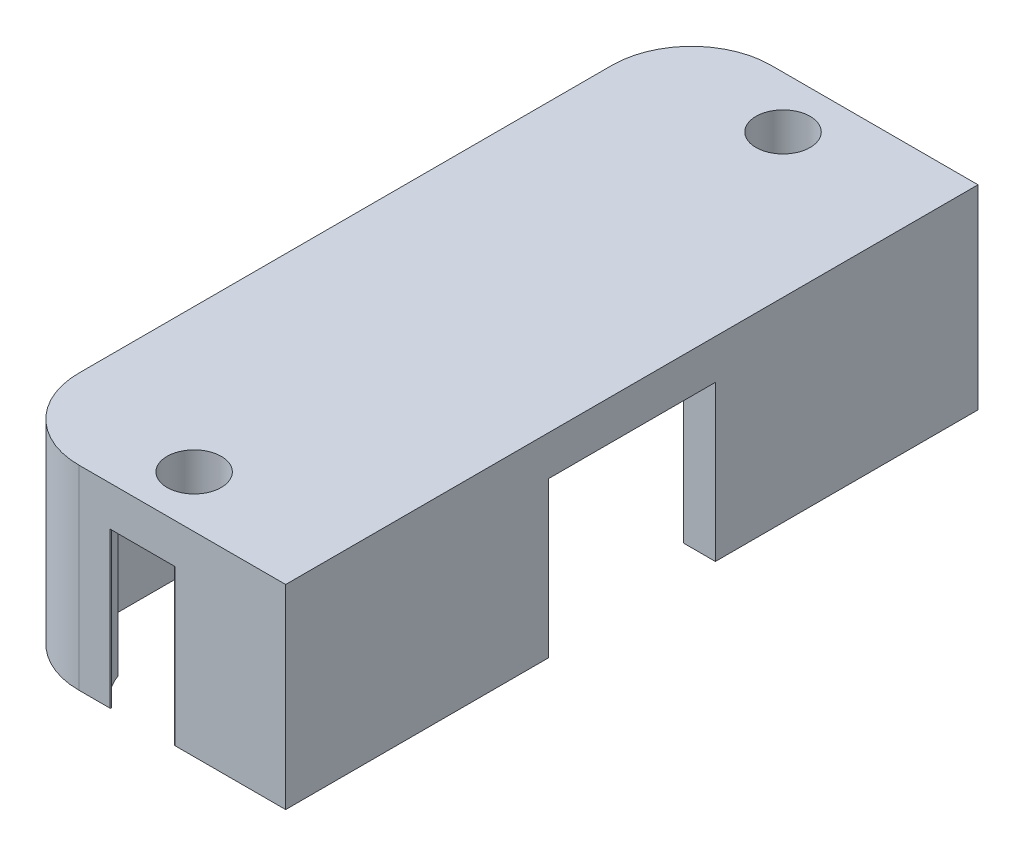
ISO-10303-21;
HEADER;
FILE_DESCRIPTION(('STEP AP214'),'2;1');
FILE_NAME('part.step','',(''),(''),'','','');
FILE_SCHEMA(('AUTOMOTIVE_DESIGN { 1 0 10303 214 1 1 1 1 }'));
ENDSEC;
DATA;
#1=APPLICATION_CONTEXT('core data for automotive mechanical design processes');
#2=APPLICATION_PROTOCOL_DEFINITION('international standard','automotive_design',2000,#1);
#3=PRODUCT_CONTEXT('',#1,'mechanical');
#4=PRODUCT('Part','Part','',(#3));
#5=PRODUCT_RELATED_PRODUCT_CATEGORY('part','',(#4));
#6=PRODUCT_DEFINITION_FORMATION('','',#4);
#7=PRODUCT_DEFINITION_CONTEXT('part definition',#1,'design');
#8=PRODUCT_DEFINITION('design','',#6,#7);
#9=PRODUCT_DEFINITION_SHAPE('','',#8);
#10=(LENGTH_UNIT() NAMED_UNIT(*) SI_UNIT(.MILLI.,.METRE.));
#11=(NAMED_UNIT(*) PLANE_ANGLE_UNIT() SI_UNIT($,.RADIAN.));
#12=(NAMED_UNIT(*) SI_UNIT($,.STERADIAN.) SOLID_ANGLE_UNIT());
#13=UNCERTAINTY_MEASURE_WITH_UNIT(LENGTH_MEASURE(1.E-05),#10,'distance_accuracy_value','');
#14=(GEOMETRIC_REPRESENTATION_CONTEXT(3) GLOBAL_UNCERTAINTY_ASSIGNED_CONTEXT((#13)) GLOBAL_UNIT_ASSIGNED_CONTEXT((#10,
#11,#12)) REPRESENTATION_CONTEXT('',''));
#15=CARTESIAN_POINT('',(0.,0.,0.));
#16=DIRECTION('',(0.,0.,1.));
#17=DIRECTION('',(1.,0.,0.));
#18=AXIS2_PLACEMENT_3D('',#15,#16,#17);
#19=CARTESIAN_POINT('',(-4.,-9.75,19.75));
#20=DIRECTION('',(0.,0.,1.));
#21=DIRECTION('',(1.,0.,0.));
#22=AXIS2_PLACEMENT_3D('',#19,#20,#21);
#23=PLANE('',#22);
#24=DIRECTION('',(0.,1.,0.));
#25=VECTOR('',#24,1.);
#26=CARTESIAN_POINT('',(3.53553390593274,-9.75,19.75));
#27=LINE('',#26,#25);
#28=CARTESIAN_POINT('',(3.53553390593274,0.,19.75));
#29=VERTEX_POINT('',#28);
#30=CARTESIAN_POINT('',(3.53553390593274,-9.75,19.75));
#31=VERTEX_POINT('',#30);
#32=EDGE_CURVE('E223',#29,#31,#27,.F.);
#33=ORIENTED_EDGE('',*,*,#32,.F.);
#34=DIRECTION('',(1.,0.,0.));
#35=VECTOR('',#34,1.);
#36=CARTESIAN_POINT('',(-4.,0.,19.75));
#37=LINE('',#36,#35);
#38=CARTESIAN_POINT('',(7.,0.,19.75));
#39=VERTEX_POINT('',#38);
#40=EDGE_CURVE('E235',#29,#39,#37,.T.);
#41=ORIENTED_EDGE('',*,*,#40,.T.);
#42=DIRECTION('',(0.,1.,0.));
#43=VECTOR('',#42,1.);
#44=CARTESIAN_POINT('',(7.,-24.3872811683044,19.75));
#45=LINE('',#44,#43);
#46=CARTESIAN_POINT('',(7.,-9.75,19.75));
#47=VERTEX_POINT('',#46);
#48=EDGE_CURVE('E409',#47,#39,#45,.T.);
#49=ORIENTED_EDGE('',*,*,#48,.F.);
#50=DIRECTION('',(1.,0.,0.));
#51=VECTOR('',#50,1.);
#52=CARTESIAN_POINT('',(-4.,-9.75,19.75));
#53=LINE('',#52,#51);
#54=EDGE_CURVE('E237',#31,#47,#53,.T.);
#55=ORIENTED_EDGE('',*,*,#54,.F.);
#56=EDGE_LOOP('',(#33,#41,#49,#55));
#57=FACE_BOUND('',#56,.T.);
#58=ADVANCED_FACE('F35',(#57),#23,.F.);
#59=CARTESIAN_POINT('',(9.,-9.75,-19.75));
#60=DIRECTION('',(0.,0.,-1.));
#61=DIRECTION('',(-1.,0.,0.));
#62=AXIS2_PLACEMENT_3D('',#59,#60,#61);
#63=PLANE('',#62);
#64=DIRECTION('',(0.,1.,0.));
#65=VECTOR('',#64,1.);
#66=CARTESIAN_POINT('',(-3.53553390593274,-9.75,-19.75));
#67=LINE('',#66,#65);
#68=CARTESIAN_POINT('',(-3.53553390593274,0.,-19.75));
#69=VERTEX_POINT('',#68);
#70=CARTESIAN_POINT('',(-3.53553390593274,-9.75,-19.75));
#71=VERTEX_POINT('',#70);
#72=EDGE_CURVE('E448',#69,#71,#67,.F.);
#73=ORIENTED_EDGE('',*,*,#72,.F.);
#74=DIRECTION('',(-1.,0.,0.));
#75=VECTOR('',#74,1.);
#76=CARTESIAN_POINT('',(9.,0.,-19.75));
#77=LINE('',#76,#75);
#78=CARTESIAN_POINT('',(-4.,0.,-19.75));
#79=VERTEX_POINT('',#78);
#80=EDGE_CURVE('E253',#69,#79,#77,.T.);
#81=ORIENTED_EDGE('',*,*,#80,.T.);
#82=DIRECTION('',(0.,1.,0.));
#83=VECTOR('',#82,1.);
#84=CARTESIAN_POINT('',(-4.,-9.75,-19.75));
#85=LINE('',#84,#83);
#86=CARTESIAN_POINT('',(-4.,-9.75,-19.75));
#87=VERTEX_POINT('',#86);
#88=EDGE_CURVE('E272',#87,#79,#85,.T.);
#89=ORIENTED_EDGE('',*,*,#88,.F.);
#90=DIRECTION('',(-1.,0.,0.));
#91=VECTOR('',#90,1.);
#92=CARTESIAN_POINT('',(9.,-9.75,-19.75));
#93=LINE('',#92,#91);
#94=EDGE_CURVE('E417',#71,#87,#93,.T.);
#95=ORIENTED_EDGE('',*,*,#94,.F.);
#96=EDGE_LOOP('',(#73,#81,#89,#95));
#97=FACE_BOUND('',#96,.T.);
#98=ADVANCED_FACE('F430',(#97),#63,.F.);
#99=CARTESIAN_POINT('',(-4.,-9.75,-16.75));
#100=DIRECTION('',(0.,-1.,0.));
#101=DIRECTION('',(0.,0.,-1.));
#102=AXIS2_PLACEMENT_3D('',#99,#100,#101);
#103=PLANE('',#102);
#104=CARTESIAN_POINT('',(0.,-9.75,18.5));
#105=DIRECTION('',(0.,-1.,0.));
#106=DIRECTION('',(0.,0.,-1.));
#107=AXIS2_PLACEMENT_3D('',#104,#105,#106);
#108=CIRCLE('',#107,3.75);
#109=CARTESIAN_POINT('',(-2.02242449328149,-9.75,21.6578947368421));
#110=VERTEX_POINT('',#109);
#111=CARTESIAN_POINT('',(-3.53553390593274,-9.75,19.75));
#112=VERTEX_POINT('',#111);
#113=EDGE_CURVE('E229',#110,#112,#108,.T.);
#114=ORIENTED_EDGE('',*,*,#113,.F.);
#115=CARTESIAN_POINT('',(-2.04939015319191,-9.75,21.7));
#116=DIRECTION('',(0.,-1.,0.));
#117=DIRECTION('',(0.,0.,-1.));
#118=AXIS2_PLACEMENT_3D('',#115,#116,#117);
#119=CIRCLE('',#118,0.05);
#120=CARTESIAN_POINT('',(-2.04939015319191,-9.75,21.75));
#121=VERTEX_POINT('',#120);
#122=EDGE_CURVE('E321',#110,#121,#119,.T.);
#123=ORIENTED_EDGE('',*,*,#122,.T.);
#124=DIRECTION('',(1.,0.,0.));
#125=VECTOR('',#124,1.);
#126=CARTESIAN_POINT('',(-4.,-9.75,21.75));
#127=LINE('',#126,#125);
#128=CARTESIAN_POINT('',(-4.,-9.75,21.75));
#129=VERTEX_POINT('',#128);
#130=EDGE_CURVE('E382',#129,#121,#127,.T.);
#131=ORIENTED_EDGE('',*,*,#130,.F.);
#132=CARTESIAN_POINT('',(-4.,-9.75,16.75));
#133=DIRECTION('',(0.,-1.,0.));
#134=DIRECTION('',(0.,0.,-1.));
#135=AXIS2_PLACEMENT_3D('',#132,#133,#134);
#136=CIRCLE('',#135,5.);
#137=CARTESIAN_POINT('',(-9.,-9.75,16.75));
#138=VERTEX_POINT('',#137);
#139=EDGE_CURVE('E378',#129,#138,#136,.T.);
#140=ORIENTED_EDGE('',*,*,#139,.T.);
#141=DIRECTION('',(0.,0.,1.));
#142=VECTOR('',#141,1.);
#143=CARTESIAN_POINT('',(-9.,-9.75,-16.75));
#144=LINE('',#143,#142);
#145=CARTESIAN_POINT('',(-9.,-9.75,-16.75));
#146=VERTEX_POINT('',#145);
#147=EDGE_CURVE('E370',#146,#138,#144,.T.);
#148=ORIENTED_EDGE('',*,*,#147,.F.);
#149=CARTESIAN_POINT('',(-4.,-9.75,-16.75));
#150=DIRECTION('',(0.,-1.,0.));
#151=DIRECTION('',(0.,0.,-1.));
#152=AXIS2_PLACEMENT_3D('',#149,#150,#151);
#153=CIRCLE('',#152,5.);
#154=CARTESIAN_POINT('',(-4.,-9.75,-21.75));
#155=VERTEX_POINT('',#154);
#156=EDGE_CURVE('E366',#146,#155,#153,.T.);
#157=ORIENTED_EDGE('',*,*,#156,.T.);
#158=DIRECTION('',(-1.,0.,0.));
#159=VECTOR('',#158,1.);
#160=CARTESIAN_POINT('',(9.,-9.75,-21.75));
#161=LINE('',#160,#159);
#162=CARTESIAN_POINT('',(-2.04939015319193,-9.75,-21.75));
#163=VERTEX_POINT('',#162);
#164=EDGE_CURVE('E367',#163,#155,#161,.T.);
#165=ORIENTED_EDGE('',*,*,#164,.F.);
#166=CARTESIAN_POINT('',(-2.04939015319193,-9.75,-21.7));
#167=DIRECTION('',(0.,-1.,0.));
#168=DIRECTION('',(0.,0.,-1.));
#169=AXIS2_PLACEMENT_3D('',#166,#167,#168);
#170=CIRCLE('',#169,0.05);
#171=CARTESIAN_POINT('',(-2.02242449328151,-9.75,-21.6578947368421));
#172=VERTEX_POINT('',#171);
#173=EDGE_CURVE('E319',#163,#172,#170,.T.);
#174=ORIENTED_EDGE('',*,*,#173,.T.);
#175=CARTESIAN_POINT('',(0.,-9.75,-18.5));
#176=DIRECTION('',(0.,-1.,0.));
#177=DIRECTION('',(0.,0.,-1.));
#178=AXIS2_PLACEMENT_3D('',#175,#176,#177);
#179=CIRCLE('',#178,3.75);
#180=EDGE_CURVE('E350',#71,#172,#179,.T.);
#181=ORIENTED_EDGE('',*,*,#180,.F.);
#182=ORIENTED_EDGE('',*,*,#94,.T.);
#183=CARTESIAN_POINT('',(-4.,-9.75,-16.75));
#184=DIRECTION('',(0.,-1.,0.));
#185=DIRECTION('',(0.,0.,-1.));
#186=AXIS2_PLACEMENT_3D('',#183,#184,#185);
#187=CIRCLE('',#186,3.00000000000001);
#188=CARTESIAN_POINT('',(-7.,-9.75,-16.75));
#189=VERTEX_POINT('',#188);
#190=EDGE_CURVE('E261',#189,#87,#187,.T.);
#191=ORIENTED_EDGE('',*,*,#190,.F.);
#192=DIRECTION('',(0.,0.,1.));
#193=VECTOR('',#192,1.);
#194=CARTESIAN_POINT('',(-7.,-9.75,-16.75));
#195=LINE('',#194,#193);
#196=CARTESIAN_POINT('',(-7.,-9.75,16.75));
#197=VERTEX_POINT('',#196);
#198=EDGE_CURVE('E275',#189,#197,#195,.T.);
#199=ORIENTED_EDGE('',*,*,#198,.T.);
#200=CARTESIAN_POINT('',(-4.,-9.75,16.75));
#201=DIRECTION('',(0.,-1.,0.));
#202=DIRECTION('',(0.,0.,-1.));
#203=AXIS2_PLACEMENT_3D('',#200,#201,#202);
#204=CIRCLE('',#203,3.);
#205=CARTESIAN_POINT('',(-4.,-9.75,19.75));
#206=VERTEX_POINT('',#205);
#207=EDGE_CURVE('E390',#206,#197,#204,.T.);
#208=ORIENTED_EDGE('',*,*,#207,.F.);
#209=EDGE_CURVE('E387',#206,#112,#53,.T.);
#210=ORIENTED_EDGE('',*,*,#209,.T.);
#211=EDGE_LOOP('',(#114,#123,#131,#140,#148,#157,#165,#174,#181,#182,#191,#199,#208,#210));
#212=FACE_BOUND('',#211,.T.);
#213=ADVANCED_FACE('F426',(#212),#103,.T.);
#214=CARTESIAN_POINT('',(2.04939015319191,-9.75,21.75));
#215=VERTEX_POINT('',#214);
#216=CARTESIAN_POINT('',(9.,-9.75,21.75));
#217=VERTEX_POINT('',#216);
#218=EDGE_CURVE('E381',#215,#217,#127,.T.);
#219=ORIENTED_EDGE('',*,*,#218,.F.);
#220=CARTESIAN_POINT('',(2.04939015319191,-9.75,21.7));
#221=DIRECTION('',(0.,-1.,0.));
#222=DIRECTION('',(0.,0.,-1.));
#223=AXIS2_PLACEMENT_3D('',#220,#221,#222);
#224=CIRCLE('',#223,0.05);
#225=CARTESIAN_POINT('',(2.02242449328149,-9.75,21.6578947368421));
#226=VERTEX_POINT('',#225);
#227=EDGE_CURVE('E314',#215,#226,#224,.T.);
#228=ORIENTED_EDGE('',*,*,#227,.T.);
#229=EDGE_CURVE('E499',#31,#226,#108,.T.);
#230=ORIENTED_EDGE('',*,*,#229,.F.);
#231=ORIENTED_EDGE('',*,*,#54,.T.);
#232=DIRECTION('',(0.,0.,-1.));
#233=VECTOR('',#232,1.);
#234=CARTESIAN_POINT('',(7.,-9.75,19.75));
#235=LINE('',#234,#233);
#236=CARTESIAN_POINT('',(7.,-9.75,5.25));
#237=VERTEX_POINT('',#236);
#238=EDGE_CURVE('E395',#47,#237,#235,.T.);
#239=ORIENTED_EDGE('',*,*,#238,.T.);
#240=DIRECTION('',(1.,0.,0.));
#241=VECTOR('',#240,1.);
#242=CARTESIAN_POINT('',(9.,-9.75,5.25));
#243=LINE('',#242,#241);
#244=CARTESIAN_POINT('',(9.,-9.75,5.25));
#245=VERTEX_POINT('',#244);
#246=EDGE_CURVE('E399',#237,#245,#243,.T.);
#247=ORIENTED_EDGE('',*,*,#246,.T.);
#248=DIRECTION('',(0.,0.,-1.));
#249=VECTOR('',#248,1.);
#250=CARTESIAN_POINT('',(9.,-9.75,21.75));
#251=LINE('',#250,#249);
#252=EDGE_CURVE('E385',#217,#245,#251,.T.);
#253=ORIENTED_EDGE('',*,*,#252,.F.);
#254=EDGE_LOOP('',(#219,#228,#230,#231,#239,#247,#253));
#255=FACE_BOUND('',#254,.T.);
#256=ADVANCED_FACE('F491',(#255),#103,.T.);
#257=DIRECTION('',(0.,1.,0.));
#258=VECTOR('',#257,1.);
#259=CARTESIAN_POINT('',(3.53553390593274,-9.75,-19.75));
#260=LINE('',#259,#258);
#261=CARTESIAN_POINT('',(3.53553390593274,-9.75,-19.75));
#262=VERTEX_POINT('',#261);
#263=CARTESIAN_POINT('',(3.53553390593274,0.,-19.75));
#264=VERTEX_POINT('',#263);
#265=EDGE_CURVE('E349',#262,#264,#260,.T.);
#266=ORIENTED_EDGE('',*,*,#265,.F.);
#267=CARTESIAN_POINT('',(7.00000000000001,-9.75,-19.75));
#268=VERTEX_POINT('',#267);
#269=EDGE_CURVE('E418',#268,#262,#93,.T.);
#270=ORIENTED_EDGE('',*,*,#269,.F.);
#271=DIRECTION('',(0.,1.,0.));
#272=VECTOR('',#271,1.);
#273=CARTESIAN_POINT('',(7.,-24.3872811683044,-19.75));
#274=LINE('',#273,#272);
#275=CARTESIAN_POINT('',(7.,0.,-19.75));
#276=VERTEX_POINT('',#275);
#277=EDGE_CURVE('E464',#268,#276,#274,.T.);
#278=ORIENTED_EDGE('',*,*,#277,.T.);
#279=EDGE_CURVE('E248',#276,#264,#77,.T.);
#280=ORIENTED_EDGE('',*,*,#279,.T.);
#281=EDGE_LOOP('',(#266,#270,#278,#280));
#282=FACE_BOUND('',#281,.T.);
#283=ADVANCED_FACE('F542',(#282),#63,.F.);
#284=DIRECTION('',(0.,1.,0.));
#285=VECTOR('',#284,1.);
#286=CARTESIAN_POINT('',(-3.53553390593274,-9.75,19.75));
#287=LINE('',#286,#285);
#288=CARTESIAN_POINT('',(-3.53553390593274,0.,19.75));
#289=VERTEX_POINT('',#288);
#290=EDGE_CURVE('E239',#112,#289,#287,.T.);
#291=ORIENTED_EDGE('',*,*,#290,.F.);
#292=ORIENTED_EDGE('',*,*,#209,.F.);
#293=DIRECTION('',(0.,1.,0.));
#294=VECTOR('',#293,1.);
#295=CARTESIAN_POINT('',(-4.,-9.75,19.75));
#296=LINE('',#295,#294);
#297=CARTESIAN_POINT('',(-4.,0.,19.75));
#298=VERTEX_POINT('',#297);
#299=EDGE_CURVE('E269',#206,#298,#296,.T.);
#300=ORIENTED_EDGE('',*,*,#299,.T.);
#301=EDGE_CURVE('E247',#298,#289,#37,.T.);
#302=ORIENTED_EDGE('',*,*,#301,.T.);
#303=EDGE_LOOP('',(#291,#292,#300,#302));
#304=FACE_BOUND('',#303,.T.);
#305=ADVANCED_FACE('F444',(#304),#23,.F.);
#306=CARTESIAN_POINT('',(9.,2.5,21.75));
#307=DIRECTION('',(0.,0.,-1.));
#308=DIRECTION('',(-1.,0.,0.));
#309=AXIS2_PLACEMENT_3D('',#306,#307,#308);
#310=PLANE('',#309);
#311=DIRECTION('',(-1.,0.,0.));
#312=VECTOR('',#311,1.);
#313=CARTESIAN_POINT('',(9.,0.,21.75));
#314=LINE('',#313,#312);
#315=CARTESIAN_POINT('',(2.04939015319191,0.,21.75));
#316=VERTEX_POINT('',#315);
#317=CARTESIAN_POINT('',(-2.04939015319191,0.,21.75));
#318=VERTEX_POINT('',#317);
#319=EDGE_CURVE('E497',#316,#318,#314,.T.);
#320=ORIENTED_EDGE('',*,*,#319,.F.);
#321=DIRECTION('',(0.,-1.,0.));
#322=VECTOR('',#321,1.);
#323=CARTESIAN_POINT('',(2.04939015319191,-9.75,21.75));
#324=LINE('',#323,#322);
#325=EDGE_CURVE('E312',#316,#215,#324,.T.);
#326=ORIENTED_EDGE('',*,*,#325,.T.);
#327=ORIENTED_EDGE('',*,*,#218,.T.);
#328=DIRECTION('',(0.,-1.,0.));
#329=VECTOR('',#328,1.);
#330=CARTESIAN_POINT('',(9.,2.5,21.75));
#331=LINE('',#330,#329);
#332=CARTESIAN_POINT('',(9.,2.5,21.75));
#333=VERTEX_POINT('',#332);
#334=EDGE_CURVE('E290',#333,#217,#331,.T.);
#335=ORIENTED_EDGE('',*,*,#334,.F.);
#336=DIRECTION('',(1.,0.,0.));
#337=VECTOR('',#336,1.);
#338=CARTESIAN_POINT('',(9.,2.5,21.75));
#339=LINE('',#338,#337);
#340=CARTESIAN_POINT('',(-4.,2.5,21.75));
#341=VERTEX_POINT('',#340);
#342=EDGE_CURVE('E279',#341,#333,#339,.T.);
#343=ORIENTED_EDGE('',*,*,#342,.F.);
#344=DIRECTION('',(0.,-1.,0.));
#345=VECTOR('',#344,1.);
#346=CARTESIAN_POINT('',(-4.,2.5,21.75));
#347=LINE('',#346,#345);
#348=EDGE_CURVE('E303',#341,#129,#347,.T.);
#349=ORIENTED_EDGE('',*,*,#348,.T.);
#350=ORIENTED_EDGE('',*,*,#130,.T.);
#351=DIRECTION('',(0.,-1.,0.));
#352=VECTOR('',#351,1.);
#353=CARTESIAN_POINT('',(-2.04939015319191,0.,21.75));
#354=LINE('',#353,#352);
#355=EDGE_CURVE('E309',#121,#318,#354,.F.);
#356=ORIENTED_EDGE('',*,*,#355,.T.);
#357=EDGE_LOOP('',(#320,#326,#327,#335,#343,#349,#350,#356));
#358=FACE_BOUND('',#357,.T.);
#359=ADVANCED_FACE('F502',(#358),#310,.F.);
#360=CARTESIAN_POINT('',(9.,2.5,-21.75));
#361=DIRECTION('',(0.,0.,1.));
#362=DIRECTION('',(1.,0.,0.));
#363=AXIS2_PLACEMENT_3D('',#360,#361,#362);
#364=PLANE('',#363);
#365=CARTESIAN_POINT('',(9.,-9.75,-21.75));
#366=VERTEX_POINT('',#365);
#367=CARTESIAN_POINT('',(2.04939015319193,-9.75,-21.75));
#368=VERTEX_POINT('',#367);
#369=EDGE_CURVE('E358',#366,#368,#161,.T.);
#370=ORIENTED_EDGE('',*,*,#369,.T.);
#371=DIRECTION('',(0.,-1.,0.));
#372=VECTOR('',#371,1.);
#373=CARTESIAN_POINT('',(2.04939015319193,0.,-21.75));
#374=LINE('',#373,#372);
#375=CARTESIAN_POINT('',(2.04939015319193,0.,-21.75));
#376=VERTEX_POINT('',#375);
#377=EDGE_CURVE('E330',#368,#376,#374,.F.);
#378=ORIENTED_EDGE('',*,*,#377,.T.);
#379=DIRECTION('',(1.,0.,0.));
#380=VECTOR('',#379,1.);
#381=CARTESIAN_POINT('',(9.,0.,-21.75));
#382=LINE('',#381,#380);
#383=CARTESIAN_POINT('',(-2.04939015319193,0.,-21.75));
#384=VERTEX_POINT('',#383);
#385=EDGE_CURVE('E55',#384,#376,#382,.T.);
#386=ORIENTED_EDGE('',*,*,#385,.F.);
#387=DIRECTION('',(0.,-1.,0.));
#388=VECTOR('',#387,1.);
#389=CARTESIAN_POINT('',(-2.04939015319193,-9.75,-21.75));
#390=LINE('',#389,#388);
#391=EDGE_CURVE('E328',#384,#163,#390,.T.);
#392=ORIENTED_EDGE('',*,*,#391,.T.);
#393=ORIENTED_EDGE('',*,*,#164,.T.);
#394=DIRECTION('',(0.,-1.,0.));
#395=VECTOR('',#394,1.);
#396=CARTESIAN_POINT('',(-4.,2.5,-21.75));
#397=LINE('',#396,#395);
#398=CARTESIAN_POINT('',(-4.,2.5,-21.75));
#399=VERTEX_POINT('',#398);
#400=EDGE_CURVE('E297',#155,#399,#397,.F.);
#401=ORIENTED_EDGE('',*,*,#400,.T.);
#402=DIRECTION('',(-1.,0.,0.));
#403=VECTOR('',#402,1.);
#404=CARTESIAN_POINT('',(9.,2.5,-21.75));
#405=LINE('',#404,#403);
#406=CARTESIAN_POINT('',(9.,2.5,-21.75));
#407=VERTEX_POINT('',#406);
#408=EDGE_CURVE('E283',#407,#399,#405,.T.);
#409=ORIENTED_EDGE('',*,*,#408,.F.);
#410=DIRECTION('',(0.,-1.,0.));
#411=VECTOR('',#410,1.);
#412=CARTESIAN_POINT('',(9.,2.5,-21.75));
#413=LINE('',#412,#411);
#414=EDGE_CURVE('E286',#407,#366,#413,.T.);
#415=ORIENTED_EDGE('',*,*,#414,.T.);
#416=EDGE_LOOP('',(#370,#378,#386,#392,#393,#401,#409,#415));
#417=FACE_BOUND('',#416,.T.);
#418=ADVANCED_FACE('F363',(#417),#364,.F.);
#419=CARTESIAN_POINT('',(0.,2.5,-18.5));
#420=DIRECTION('',(0.,1.,0.));
#421=DIRECTION('',(0.,0.,1.));
#422=AXIS2_PLACEMENT_3D('',#419,#420,#421);
#423=CYLINDRICAL_SURFACE('',#422,1.7);
#424=CARTESIAN_POINT('',(0.,2.5,-18.5));
#425=DIRECTION('',(0.,1.,0.));
#426=DIRECTION('',(0.,0.,1.));
#427=AXIS2_PLACEMENT_3D('',#424,#425,#426);
#428=CIRCLE('',#427,1.7);
#429=CARTESIAN_POINT('',(0.,2.5,-16.8));
#430=VERTEX_POINT('',#429);
#431=EDGE_CURVE('E455',#430,#430,#428,.T.);
#432=ORIENTED_EDGE('',*,*,#431,.T.);
#433=EDGE_LOOP('',(#432));
#434=FACE_BOUND('',#433,.T.);
#435=CARTESIAN_POINT('',(0.,0.,-18.5));
#436=DIRECTION('',(0.,1.,0.));
#437=DIRECTION('',(0.,0.,1.));
#438=AXIS2_PLACEMENT_3D('',#435,#436,#437);
#439=CIRCLE('',#438,1.7);
#440=CARTESIAN_POINT('',(0.,0.,-16.8));
#441=VERTEX_POINT('',#440);
#442=EDGE_CURVE('E458',#441,#441,#439,.T.);
#443=ORIENTED_EDGE('',*,*,#442,.F.);
#444=EDGE_LOOP('',(#443));
#445=FACE_BOUND('',#444,.T.);
#446=ADVANCED_FACE('F573',(#434,#445),#423,.F.);
#447=CARTESIAN_POINT('',(0.,2.5,18.5));
#448=DIRECTION('',(0.,1.,0.));
#449=DIRECTION('',(0.,0.,1.));
#450=AXIS2_PLACEMENT_3D('',#447,#448,#449);
#451=CYLINDRICAL_SURFACE('',#450,1.7);
#452=CARTESIAN_POINT('',(0.,2.5,18.5));
#453=DIRECTION('',(0.,1.,0.));
#454=DIRECTION('',(0.,0.,1.));
#455=AXIS2_PLACEMENT_3D('',#452,#453,#454);
#456=CIRCLE('',#455,1.7);
#457=CARTESIAN_POINT('',(0.,2.5,20.2));
#458=VERTEX_POINT('',#457);
#459=EDGE_CURVE('E238',#458,#458,#456,.T.);
#460=ORIENTED_EDGE('',*,*,#459,.T.);
#461=EDGE_LOOP('',(#460));
#462=FACE_BOUND('',#461,.T.);
#463=CARTESIAN_POINT('',(0.,0.,18.5));
#464=DIRECTION('',(0.,1.,0.));
#465=DIRECTION('',(0.,0.,1.));
#466=AXIS2_PLACEMENT_3D('',#463,#464,#465);
#467=CIRCLE('',#466,1.7);
#468=CARTESIAN_POINT('',(0.,0.,20.2));
#469=VERTEX_POINT('',#468);
#470=EDGE_CURVE('E305',#469,#469,#467,.T.);
#471=ORIENTED_EDGE('',*,*,#470,.F.);
#472=EDGE_LOOP('',(#471));
#473=FACE_BOUND('',#472,.T.);
#474=ADVANCED_FACE('F563',(#462,#473),#451,.F.);
#475=CARTESIAN_POINT('',(2.02242449328151,-9.75,-21.6578947368421));
#476=VERTEX_POINT('',#475);
#477=EDGE_CURVE('E361',#476,#262,#179,.T.);
#478=ORIENTED_EDGE('',*,*,#477,.F.);
#479=CARTESIAN_POINT('',(2.04939015319193,-9.75,-21.7));
#480=DIRECTION('',(0.,-1.,0.));
#481=DIRECTION('',(0.,0.,-1.));
#482=AXIS2_PLACEMENT_3D('',#479,#480,#481);
#483=CIRCLE('',#482,0.05);
#484=EDGE_CURVE('E326',#476,#368,#483,.T.);
#485=ORIENTED_EDGE('',*,*,#484,.T.);
#486=ORIENTED_EDGE('',*,*,#369,.F.);
#487=DIRECTION('',(0.,0.,-1.));
#488=VECTOR('',#487,1.);
#489=CARTESIAN_POINT('',(9.,-9.75,-19.75));
#490=LINE('',#489,#488);
#491=CARTESIAN_POINT('',(9.00000000000001,-9.75,-5.25));
#492=VERTEX_POINT('',#491);
#493=EDGE_CURVE('E372',#492,#366,#490,.T.);
#494=ORIENTED_EDGE('',*,*,#493,.F.);
#495=DIRECTION('',(-1.,0.,0.));
#496=VECTOR('',#495,1.);
#497=CARTESIAN_POINT('',(9.00000000000001,-9.75,-5.25));
#498=LINE('',#497,#496);
#499=CARTESIAN_POINT('',(7.,-9.75,-5.25));
#500=VERTEX_POINT('',#499);
#501=EDGE_CURVE('E470',#492,#500,#498,.T.);
#502=ORIENTED_EDGE('',*,*,#501,.T.);
#503=DIRECTION('',(0.,0.,-1.));
#504=VECTOR('',#503,1.);
#505=CARTESIAN_POINT('',(7.,-9.75,-19.75));
#506=LINE('',#505,#504);
#507=EDGE_CURVE('E415',#500,#268,#506,.T.);
#508=ORIENTED_EDGE('',*,*,#507,.T.);
#509=ORIENTED_EDGE('',*,*,#269,.T.);
#510=EDGE_LOOP('',(#478,#485,#486,#494,#502,#508,#509));
#511=FACE_BOUND('',#510,.T.);
#512=ADVANCED_FACE('F357',(#511),#103,.T.);
#513=CARTESIAN_POINT('',(0.,0.,0.));
#514=DIRECTION('',(0.,1.,0.));
#515=DIRECTION('',(0.,0.,1.));
#516=AXIS2_PLACEMENT_3D('',#513,#514,#515);
#517=PLANE('',#516);
#518=ORIENTED_EDGE('',*,*,#40,.F.);
#519=CARTESIAN_POINT('',(0.,0.,18.5));
#520=DIRECTION('',(0.,-1.,0.));
#521=DIRECTION('',(0.,0.,-1.));
#522=AXIS2_PLACEMENT_3D('',#519,#520,#521);
#523=CIRCLE('',#522,3.75);
#524=CARTESIAN_POINT('',(2.02242449328149,0.,21.6578947368421));
#525=VERTEX_POINT('',#524);
#526=EDGE_CURVE('E219',#29,#525,#523,.T.);
#527=ORIENTED_EDGE('',*,*,#526,.T.);
#528=CARTESIAN_POINT('',(2.04939015319191,0.,21.7));
#529=DIRECTION('',(0.,1.,0.));
#530=DIRECTION('',(0.,0.,1.));
#531=AXIS2_PLACEMENT_3D('',#528,#529,#530);
#532=CIRCLE('',#531,0.05);
#533=EDGE_CURVE('E334',#525,#316,#532,.T.);
#534=ORIENTED_EDGE('',*,*,#533,.T.);
#535=ORIENTED_EDGE('',*,*,#319,.T.);
#536=CARTESIAN_POINT('',(-2.04939015319191,0.,21.7));
#537=DIRECTION('',(0.,1.,0.));
#538=DIRECTION('',(0.,0.,1.));
#539=AXIS2_PLACEMENT_3D('',#536,#537,#538);
#540=CIRCLE('',#539,0.05);
#541=CARTESIAN_POINT('',(-2.02242449328149,0.,21.6578947368421));
#542=VERTEX_POINT('',#541);
#543=EDGE_CURVE('E336',#318,#542,#540,.T.);
#544=ORIENTED_EDGE('',*,*,#543,.T.);
#545=EDGE_CURVE('E230',#542,#289,#523,.T.);
#546=ORIENTED_EDGE('',*,*,#545,.T.);
#547=ORIENTED_EDGE('',*,*,#301,.F.);
#548=CARTESIAN_POINT('',(-4.,0.,16.75));
#549=DIRECTION('',(0.,-1.,0.));
#550=DIRECTION('',(0.,0.,-1.));
#551=AXIS2_PLACEMENT_3D('',#548,#549,#550);
#552=CIRCLE('',#551,3.);
#553=CARTESIAN_POINT('',(-7.,0.,16.75));
#554=VERTEX_POINT('',#553);
#555=EDGE_CURVE('E251',#298,#554,#552,.T.);
#556=ORIENTED_EDGE('',*,*,#555,.T.);
#557=DIRECTION('',(0.,0.,1.));
#558=VECTOR('',#557,1.);
#559=CARTESIAN_POINT('',(-7.,0.,-16.75));
#560=LINE('',#559,#558);
#561=CARTESIAN_POINT('',(-7.,0.,-16.75));
#562=VERTEX_POINT('',#561);
#563=EDGE_CURVE('E258',#562,#554,#560,.T.);
#564=ORIENTED_EDGE('',*,*,#563,.F.);
#565=CARTESIAN_POINT('',(-4.,0.,-16.75));
#566=DIRECTION('',(0.,-1.,0.));
#567=DIRECTION('',(0.,0.,-1.));
#568=AXIS2_PLACEMENT_3D('',#565,#566,#567);
#569=CIRCLE('',#568,3.00000000000001);
#570=EDGE_CURVE('E393',#562,#79,#569,.T.);
#571=ORIENTED_EDGE('',*,*,#570,.T.);
#572=ORIENTED_EDGE('',*,*,#80,.F.);
#573=CARTESIAN_POINT('',(0.,0.,-18.5));
#574=DIRECTION('',(0.,-1.,0.));
#575=DIRECTION('',(0.,0.,-1.));
#576=AXIS2_PLACEMENT_3D('',#573,#574,#575);
#577=CIRCLE('',#576,3.75);
#578=CARTESIAN_POINT('',(-2.02242449328151,0.,-21.6578947368421));
#579=VERTEX_POINT('',#578);
#580=EDGE_CURVE('E351',#69,#579,#577,.T.);
#581=ORIENTED_EDGE('',*,*,#580,.T.);
#582=CARTESIAN_POINT('',(-2.04939015319193,0.,-21.7));
#583=DIRECTION('',(0.,1.,0.));
#584=DIRECTION('',(0.,0.,1.));
#585=AXIS2_PLACEMENT_3D('',#582,#583,#584);
#586=CIRCLE('',#585,0.05);
#587=EDGE_CURVE('E11',#579,#384,#586,.T.);
#588=ORIENTED_EDGE('',*,*,#587,.T.);
#589=ORIENTED_EDGE('',*,*,#385,.T.);
#590=CARTESIAN_POINT('',(2.04939015319193,0.,-21.7));
#591=DIRECTION('',(0.,1.,0.));
#592=DIRECTION('',(0.,0.,1.));
#593=AXIS2_PLACEMENT_3D('',#590,#591,#592);
#594=CIRCLE('',#593,0.05);
#595=CARTESIAN_POINT('',(2.02242449328151,0.,-21.6578947368421));
#596=VERTEX_POINT('',#595);
#597=EDGE_CURVE('E43',#376,#596,#594,.T.);
#598=ORIENTED_EDGE('',*,*,#597,.T.);
#599=EDGE_CURVE('E340',#596,#264,#577,.T.);
#600=ORIENTED_EDGE('',*,*,#599,.T.);
#601=ORIENTED_EDGE('',*,*,#279,.F.);
#602=DIRECTION('',(0.,0.,-1.));
#603=VECTOR('',#602,1.);
#604=CARTESIAN_POINT('',(7.,0.,-19.75));
#605=LINE('',#604,#603);
#606=CARTESIAN_POINT('',(7.,0.,-5.25));
#607=VERTEX_POINT('',#606);
#608=EDGE_CURVE('E462',#607,#276,#605,.T.);
#609=ORIENTED_EDGE('',*,*,#608,.F.);
#610=DIRECTION('',(-1.,0.,0.));
#611=VECTOR('',#610,1.);
#612=CARTESIAN_POINT('',(9.00000000000001,0.,-5.25));
#613=LINE('',#612,#611);
#614=CARTESIAN_POINT('',(9.00000000000001,0.,-5.25));
#615=VERTEX_POINT('',#614);
#616=EDGE_CURVE('E466',#615,#607,#613,.T.);
#617=ORIENTED_EDGE('',*,*,#616,.F.);
#618=DIRECTION('',(0.,0.,-1.));
#619=VECTOR('',#618,1.);
#620=CARTESIAN_POINT('',(9.,0.,21.75));
#621=LINE('',#620,#619);
#622=CARTESIAN_POINT('',(9.,0.,5.25));
#623=VERTEX_POINT('',#622);
#624=EDGE_CURVE('E265',#623,#615,#621,.T.);
#625=ORIENTED_EDGE('',*,*,#624,.F.);
#626=DIRECTION('',(1.,0.,0.));
#627=VECTOR('',#626,1.);
#628=CARTESIAN_POINT('',(9.,0.,5.25));
#629=LINE('',#628,#627);
#630=CARTESIAN_POINT('',(7.,0.,5.25));
#631=VERTEX_POINT('',#630);
#632=EDGE_CURVE('E404',#631,#623,#629,.T.);
#633=ORIENTED_EDGE('',*,*,#632,.F.);
#634=DIRECTION('',(0.,0.,-1.));
#635=VECTOR('',#634,1.);
#636=CARTESIAN_POINT('',(7.,0.,19.75));
#637=LINE('',#636,#635);
#638=EDGE_CURVE('E246',#39,#631,#637,.T.);
#639=ORIENTED_EDGE('',*,*,#638,.F.);
#640=EDGE_LOOP('',(#518,#527,#534,#535,#544,#546,#547,#556,#564,#571,#572,#581,#588,#589,#598,
#600,#601,#609,#617,#625,#633,#639));
#641=FACE_BOUND('',#640,.T.);
#642=ORIENTED_EDGE('',*,*,#470,.T.);
#643=EDGE_LOOP('',(#642));
#644=FACE_BOUND('',#643,.T.);
#645=ORIENTED_EDGE('',*,*,#442,.T.);
#646=EDGE_LOOP('',(#645));
#647=FACE_BOUND('',#646,.T.);
#648=ADVANCED_FACE('F242',(#641,#644,#647),#517,.F.);
#649=CARTESIAN_POINT('',(-9.,2.5,21.75));
#650=DIRECTION('',(1.,0.,0.));
#651=DIRECTION('',(0.,0.,-1.));
#652=AXIS2_PLACEMENT_3D('',#649,#650,#651);
#653=PLANE('',#652);
#654=DIRECTION('',(0.,0.,1.));
#655=VECTOR('',#654,1.);
#656=CARTESIAN_POINT('',(-9.,2.5,21.75));
#657=LINE('',#656,#655);
#658=CARTESIAN_POINT('',(-9.,2.5,-16.75));
#659=VERTEX_POINT('',#658);
#660=CARTESIAN_POINT('',(-9.,2.5,16.75));
#661=VERTEX_POINT('',#660);
#662=EDGE_CURVE('E276',#659,#661,#657,.T.);
#663=ORIENTED_EDGE('',*,*,#662,.F.);
#664=DIRECTION('',(0.,-1.,0.));
#665=VECTOR('',#664,1.);
#666=CARTESIAN_POINT('',(-9.,2.5,-16.75));
#667=LINE('',#666,#665);
#668=EDGE_CURVE('E295',#659,#146,#667,.T.);
#669=ORIENTED_EDGE('',*,*,#668,.T.);
#670=ORIENTED_EDGE('',*,*,#147,.T.);
#671=DIRECTION('',(0.,-1.,0.));
#672=VECTOR('',#671,1.);
#673=CARTESIAN_POINT('',(-9.,2.5,16.75));
#674=LINE('',#673,#672);
#675=EDGE_CURVE('E293',#138,#661,#674,.F.);
#676=ORIENTED_EDGE('',*,*,#675,.T.);
#677=EDGE_LOOP('',(#663,#669,#670,#676));
#678=FACE_BOUND('',#677,.T.);
#679=ADVANCED_FACE('F528',(#678),#653,.F.);
#680=CARTESIAN_POINT('',(9.,2.5,21.75));
#681=DIRECTION('',(-1.,0.,0.));
#682=DIRECTION('',(0.,0.,1.));
#683=AXIS2_PLACEMENT_3D('',#680,#681,#682);
#684=PLANE('',#683);
#685=ORIENTED_EDGE('',*,*,#624,.T.);
#686=DIRECTION('',(0.,1.,0.));
#687=VECTOR('',#686,1.);
#688=CARTESIAN_POINT('',(9.00000000000001,-24.3872811683044,-5.25));
#689=LINE('',#688,#687);
#690=EDGE_CURVE('E461',#492,#615,#689,.T.);
#691=ORIENTED_EDGE('',*,*,#690,.F.);
#692=ORIENTED_EDGE('',*,*,#493,.T.);
#693=ORIENTED_EDGE('',*,*,#414,.F.);
#694=DIRECTION('',(0.,0.,-1.));
#695=VECTOR('',#694,1.);
#696=CARTESIAN_POINT('',(9.,2.5,21.75));
#697=LINE('',#696,#695);
#698=EDGE_CURVE('E281',#333,#407,#697,.T.);
#699=ORIENTED_EDGE('',*,*,#698,.F.);
#700=ORIENTED_EDGE('',*,*,#334,.T.);
#701=ORIENTED_EDGE('',*,*,#252,.T.);
#702=DIRECTION('',(0.,1.,0.));
#703=VECTOR('',#702,1.);
#704=CARTESIAN_POINT('',(9.,-24.3872811683044,5.25));
#705=LINE('',#704,#703);
#706=EDGE_CURVE('E411',#245,#623,#705,.T.);
#707=ORIENTED_EDGE('',*,*,#706,.T.);
#708=EDGE_LOOP('',(#685,#691,#692,#693,#699,#700,#701,#707));
#709=FACE_BOUND('',#708,.T.);
#710=ADVANCED_FACE('F486',(#709),#684,.F.);
#711=CARTESIAN_POINT('',(0.,2.5,0.));
#712=DIRECTION('',(0.,1.,0.));
#713=DIRECTION('',(0.,0.,1.));
#714=AXIS2_PLACEMENT_3D('',#711,#712,#713);
#715=PLANE('',#714);
#716=ORIENTED_EDGE('',*,*,#459,.F.);
#717=EDGE_LOOP('',(#716));
#718=FACE_BOUND('',#717,.T.);
#719=ORIENTED_EDGE('',*,*,#431,.F.);
#720=EDGE_LOOP('',(#719));
#721=FACE_BOUND('',#720,.T.);
#722=ORIENTED_EDGE('',*,*,#408,.T.);
#723=CARTESIAN_POINT('',(-4.,2.5,-16.75));
#724=DIRECTION('',(0.,1.,0.));
#725=DIRECTION('',(0.,0.,1.));
#726=AXIS2_PLACEMENT_3D('',#723,#724,#725);
#727=CIRCLE('',#726,5.);
#728=EDGE_CURVE('E301',#399,#659,#727,.T.);
#729=ORIENTED_EDGE('',*,*,#728,.T.);
#730=ORIENTED_EDGE('',*,*,#662,.T.);
#731=CARTESIAN_POINT('',(-4.,2.5,16.75));
#732=DIRECTION('',(0.,1.,0.));
#733=DIRECTION('',(0.,0.,1.));
#734=AXIS2_PLACEMENT_3D('',#731,#732,#733);
#735=CIRCLE('',#734,5.);
#736=EDGE_CURVE('E299',#661,#341,#735,.T.);
#737=ORIENTED_EDGE('',*,*,#736,.T.);
#738=ORIENTED_EDGE('',*,*,#342,.T.);
#739=ORIENTED_EDGE('',*,*,#698,.T.);
#740=EDGE_LOOP('',(#722,#729,#730,#737,#738,#739));
#741=FACE_BOUND('',#740,.T.);
#742=ADVANCED_FACE('F525',(#718,#721,#741),#715,.T.);
#743=CARTESIAN_POINT('',(-4.,2.5,-16.75));
#744=DIRECTION('',(0.,-1.,0.));
#745=DIRECTION('',(0.,0.,-1.));
#746=AXIS2_PLACEMENT_3D('',#743,#744,#745);
#747=CYLINDRICAL_SURFACE('',#746,5.);
#748=ORIENTED_EDGE('',*,*,#728,.F.);
#749=ORIENTED_EDGE('',*,*,#400,.F.);
#750=ORIENTED_EDGE('',*,*,#156,.F.);
#751=ORIENTED_EDGE('',*,*,#668,.F.);
#752=EDGE_LOOP('',(#748,#749,#750,#751));
#753=FACE_BOUND('',#752,.T.);
#754=ADVANCED_FACE('F521',(#753),#747,.T.);
#755=CARTESIAN_POINT('',(-4.,2.5,16.75));
#756=DIRECTION('',(0.,-1.,0.));
#757=DIRECTION('',(0.,0.,-1.));
#758=AXIS2_PLACEMENT_3D('',#755,#756,#757);
#759=CYLINDRICAL_SURFACE('',#758,5.);
#760=ORIENTED_EDGE('',*,*,#736,.F.);
#761=ORIENTED_EDGE('',*,*,#675,.F.);
#762=ORIENTED_EDGE('',*,*,#139,.F.);
#763=ORIENTED_EDGE('',*,*,#348,.F.);
#764=EDGE_LOOP('',(#760,#761,#762,#763));
#765=FACE_BOUND('',#764,.T.);
#766=ADVANCED_FACE('F531',(#765),#759,.T.);
#767=CARTESIAN_POINT('',(-4.,-9.75,-16.75));
#768=DIRECTION('',(0.,1.,0.));
#769=DIRECTION('',(0.,0.,1.));
#770=AXIS2_PLACEMENT_3D('',#767,#768,#769);
#771=CYLINDRICAL_SURFACE('',#770,3.00000000000001);
#772=ORIENTED_EDGE('',*,*,#570,.F.);
#773=DIRECTION('',(0.,1.,0.));
#774=VECTOR('',#773,1.);
#775=CARTESIAN_POINT('',(-7.,-9.75,-16.75));
#776=LINE('',#775,#774);
#777=EDGE_CURVE('E262',#189,#562,#776,.T.);
#778=ORIENTED_EDGE('',*,*,#777,.F.);
#779=ORIENTED_EDGE('',*,*,#190,.T.);
#780=ORIENTED_EDGE('',*,*,#88,.T.);
#781=EDGE_LOOP('',(#772,#778,#779,#780));
#782=FACE_BOUND('',#781,.T.);
#783=ADVANCED_FACE('F432',(#782),#771,.F.);
#784=CARTESIAN_POINT('',(-7.,-9.75,-16.75));
#785=DIRECTION('',(-1.,0.,0.));
#786=DIRECTION('',(0.,0.,1.));
#787=AXIS2_PLACEMENT_3D('',#784,#785,#786);
#788=PLANE('',#787);
#789=ORIENTED_EDGE('',*,*,#563,.T.);
#790=DIRECTION('',(0.,1.,0.));
#791=VECTOR('',#790,1.);
#792=CARTESIAN_POINT('',(-7.,-9.75,16.75));
#793=LINE('',#792,#791);
#794=EDGE_CURVE('E266',#197,#554,#793,.T.);
#795=ORIENTED_EDGE('',*,*,#794,.F.);
#796=ORIENTED_EDGE('',*,*,#198,.F.);
#797=ORIENTED_EDGE('',*,*,#777,.T.);
#798=EDGE_LOOP('',(#789,#795,#796,#797));
#799=FACE_BOUND('',#798,.T.);
#800=ADVANCED_FACE('F436',(#799),#788,.F.);
#801=CARTESIAN_POINT('',(-4.,-9.75,16.75));
#802=DIRECTION('',(0.,1.,0.));
#803=DIRECTION('',(0.,0.,1.));
#804=AXIS2_PLACEMENT_3D('',#801,#802,#803);
#805=CYLINDRICAL_SURFACE('',#804,3.);
#806=ORIENTED_EDGE('',*,*,#555,.F.);
#807=ORIENTED_EDGE('',*,*,#299,.F.);
#808=ORIENTED_EDGE('',*,*,#207,.T.);
#809=ORIENTED_EDGE('',*,*,#794,.T.);
#810=EDGE_LOOP('',(#806,#807,#808,#809));
#811=FACE_BOUND('',#810,.T.);
#812=ADVANCED_FACE('F441',(#811),#805,.F.);
#813=CARTESIAN_POINT('',(7.,-24.3872811683044,19.75));
#814=DIRECTION('',(1.,0.,0.));
#815=DIRECTION('',(0.,0.,-1.));
#816=AXIS2_PLACEMENT_3D('',#813,#814,#815);
#817=PLANE('',#816);
#818=ORIENTED_EDGE('',*,*,#238,.F.);
#819=ORIENTED_EDGE('',*,*,#48,.T.);
#820=ORIENTED_EDGE('',*,*,#638,.T.);
#821=DIRECTION('',(0.,1.,0.));
#822=VECTOR('',#821,1.);
#823=CARTESIAN_POINT('',(7.,-24.3872811683044,5.25));
#824=LINE('',#823,#822);
#825=EDGE_CURVE('E412',#237,#631,#824,.T.);
#826=ORIENTED_EDGE('',*,*,#825,.F.);
#827=EDGE_LOOP('',(#818,#819,#820,#826));
#828=FACE_BOUND('',#827,.T.);
#829=ADVANCED_FACE('F559',(#828),#817,.F.);
#830=CARTESIAN_POINT('',(9.,-24.3872811683044,5.25));
#831=DIRECTION('',(0.,0.,1.));
#832=DIRECTION('',(1.,0.,0.));
#833=AXIS2_PLACEMENT_3D('',#830,#831,#832);
#834=PLANE('',#833);
#835=ORIENTED_EDGE('',*,*,#246,.F.);
#836=ORIENTED_EDGE('',*,*,#825,.T.);
#837=ORIENTED_EDGE('',*,*,#632,.T.);
#838=ORIENTED_EDGE('',*,*,#706,.F.);
#839=EDGE_LOOP('',(#835,#836,#837,#838));
#840=FACE_BOUND('',#839,.T.);
#841=ADVANCED_FACE('F481',(#840),#834,.F.);
#842=CARTESIAN_POINT('',(9.00000000000001,-24.3872811683044,-5.25));
#843=DIRECTION('',(0.,0.,-1.));
#844=DIRECTION('',(-1.,0.,0.));
#845=AXIS2_PLACEMENT_3D('',#842,#843,#844);
#846=PLANE('',#845);
#847=ORIENTED_EDGE('',*,*,#501,.F.);
#848=ORIENTED_EDGE('',*,*,#690,.T.);
#849=ORIENTED_EDGE('',*,*,#616,.T.);
#850=DIRECTION('',(0.,1.,0.));
#851=VECTOR('',#850,1.);
#852=CARTESIAN_POINT('',(7.,-24.3872811683044,-5.25));
#853=LINE('',#852,#851);
#854=EDGE_CURVE('E465',#500,#607,#853,.T.);
#855=ORIENTED_EDGE('',*,*,#854,.F.);
#856=EDGE_LOOP('',(#847,#848,#849,#855));
#857=FACE_BOUND('',#856,.T.);
#858=ADVANCED_FACE('F537',(#857),#846,.F.);
#859=CARTESIAN_POINT('',(7.,-24.3872811683044,-19.75));
#860=DIRECTION('',(1.,0.,0.));
#861=DIRECTION('',(0.,0.,-1.));
#862=AXIS2_PLACEMENT_3D('',#859,#860,#861);
#863=PLANE('',#862);
#864=ORIENTED_EDGE('',*,*,#507,.F.);
#865=ORIENTED_EDGE('',*,*,#854,.T.);
#866=ORIENTED_EDGE('',*,*,#608,.T.);
#867=ORIENTED_EDGE('',*,*,#277,.F.);
#868=EDGE_LOOP('',(#864,#865,#866,#867));
#869=FACE_BOUND('',#868,.T.);
#870=ADVANCED_FACE('F539',(#869),#863,.F.);
#871=CARTESIAN_POINT('',(0.,-9.75,18.5));
#872=DIRECTION('',(0.,1.,0.));
#873=DIRECTION('',(0.,0.,1.));
#874=AXIS2_PLACEMENT_3D('',#871,#872,#873);
#875=CYLINDRICAL_SURFACE('',#874,3.75);
#876=ORIENTED_EDGE('',*,*,#229,.T.);
#877=DIRECTION('',(0.,1.,0.));
#878=VECTOR('',#877,1.);
#879=CARTESIAN_POINT('',(2.02242449328149,-9.75,21.6578947368421));
#880=LINE('',#879,#878);
#881=EDGE_CURVE('E226',#226,#525,#880,.T.);
#882=ORIENTED_EDGE('',*,*,#881,.T.);
#883=ORIENTED_EDGE('',*,*,#526,.F.);
#884=ORIENTED_EDGE('',*,*,#32,.T.);
#885=EDGE_LOOP('',(#876,#882,#883,#884));
#886=FACE_BOUND('',#885,.T.);
#887=ADVANCED_FACE('F222',(#886),#875,.F.);
#888=ORIENTED_EDGE('',*,*,#545,.F.);
#889=DIRECTION('',(0.,1.,0.));
#890=VECTOR('',#889,1.);
#891=CARTESIAN_POINT('',(-2.02242449328149,-9.75,21.6578947368421));
#892=LINE('',#891,#890);
#893=EDGE_CURVE('E316',#542,#110,#892,.F.);
#894=ORIENTED_EDGE('',*,*,#893,.T.);
#895=ORIENTED_EDGE('',*,*,#113,.T.);
#896=ORIENTED_EDGE('',*,*,#290,.T.);
#897=EDGE_LOOP('',(#888,#894,#895,#896));
#898=FACE_BOUND('',#897,.T.);
#899=ADVANCED_FACE('F507',(#898),#875,.F.);
#900=CARTESIAN_POINT('',(0.,-9.75,-18.5));
#901=DIRECTION('',(0.,1.,0.));
#902=DIRECTION('',(0.,0.,1.));
#903=AXIS2_PLACEMENT_3D('',#900,#901,#902);
#904=CYLINDRICAL_SURFACE('',#903,3.75);
#905=ORIENTED_EDGE('',*,*,#180,.T.);
#906=DIRECTION('',(0.,1.,0.));
#907=VECTOR('',#906,1.);
#908=CARTESIAN_POINT('',(-2.02242449328151,-9.75,-21.6578947368421));
#909=LINE('',#908,#907);
#910=EDGE_CURVE('E332',#172,#579,#909,.T.);
#911=ORIENTED_EDGE('',*,*,#910,.T.);
#912=ORIENTED_EDGE('',*,*,#580,.F.);
#913=ORIENTED_EDGE('',*,*,#72,.T.);
#914=EDGE_LOOP('',(#905,#911,#912,#913));
#915=FACE_BOUND('',#914,.T.);
#916=ADVANCED_FACE('F512',(#915),#904,.F.);
#917=ORIENTED_EDGE('',*,*,#599,.F.);
#918=DIRECTION('',(0.,1.,0.));
#919=VECTOR('',#918,1.);
#920=CARTESIAN_POINT('',(2.02242449328151,-9.75,-21.6578947368421));
#921=LINE('',#920,#919);
#922=EDGE_CURVE('E323',#596,#476,#921,.F.);
#923=ORIENTED_EDGE('',*,*,#922,.T.);
#924=ORIENTED_EDGE('',*,*,#477,.T.);
#925=ORIENTED_EDGE('',*,*,#265,.T.);
#926=EDGE_LOOP('',(#917,#923,#924,#925));
#927=FACE_BOUND('',#926,.T.);
#928=ADVANCED_FACE('F346',(#927),#904,.F.);
#929=CARTESIAN_POINT('',(2.04939015319191,-9.75,21.7));
#930=DIRECTION('',(0.,1.,0.));
#931=DIRECTION('',(0.,0.,1.));
#932=AXIS2_PLACEMENT_3D('',#929,#930,#931);
#933=CYLINDRICAL_SURFACE('',#932,0.05);
#934=ORIENTED_EDGE('',*,*,#227,.F.);
#935=ORIENTED_EDGE('',*,*,#325,.F.);
#936=ORIENTED_EDGE('',*,*,#533,.F.);
#937=ORIENTED_EDGE('',*,*,#881,.F.);
#938=EDGE_LOOP('',(#934,#935,#936,#937));
#939=FACE_BOUND('',#938,.T.);
#940=ADVANCED_FACE('F496',(#939),#933,.T.);
#941=CARTESIAN_POINT('',(-2.04939015319191,-9.75,21.7));
#942=DIRECTION('',(0.,1.,0.));
#943=DIRECTION('',(0.,0.,1.));
#944=AXIS2_PLACEMENT_3D('',#941,#942,#943);
#945=CYLINDRICAL_SURFACE('',#944,0.05);
#946=ORIENTED_EDGE('',*,*,#543,.F.);
#947=ORIENTED_EDGE('',*,*,#355,.F.);
#948=ORIENTED_EDGE('',*,*,#122,.F.);
#949=ORIENTED_EDGE('',*,*,#893,.F.);
#950=EDGE_LOOP('',(#946,#947,#948,#949));
#951=FACE_BOUND('',#950,.T.);
#952=ADVANCED_FACE('F506',(#951),#945,.T.);
#953=CARTESIAN_POINT('',(2.04939015319193,-9.75,-21.7));
#954=DIRECTION('',(0.,1.,0.));
#955=DIRECTION('',(0.,0.,1.));
#956=AXIS2_PLACEMENT_3D('',#953,#954,#955);
#957=CYLINDRICAL_SURFACE('',#956,0.05);
#958=ORIENTED_EDGE('',*,*,#597,.F.);
#959=ORIENTED_EDGE('',*,*,#377,.F.);
#960=ORIENTED_EDGE('',*,*,#484,.F.);
#961=ORIENTED_EDGE('',*,*,#922,.F.);
#962=EDGE_LOOP('',(#958,#959,#960,#961));
#963=FACE_BOUND('',#962,.T.);
#964=ADVANCED_FACE('F353',(#963),#957,.T.);
#965=CARTESIAN_POINT('',(-2.04939015319193,-9.75,-21.7));
#966=DIRECTION('',(0.,1.,0.));
#967=DIRECTION('',(0.,0.,1.));
#968=AXIS2_PLACEMENT_3D('',#965,#966,#967);
#969=CYLINDRICAL_SURFACE('',#968,0.05);
#970=ORIENTED_EDGE('',*,*,#173,.F.);
#971=ORIENTED_EDGE('',*,*,#391,.F.);
#972=ORIENTED_EDGE('',*,*,#587,.F.);
#973=ORIENTED_EDGE('',*,*,#910,.F.);
#974=EDGE_LOOP('',(#970,#971,#972,#973));
#975=FACE_BOUND('',#974,.T.);
#976=ADVANCED_FACE('F37',(#975),#969,.T.);
#977=CLOSED_SHELL('',(#58,#98,#213,#256,#283,#305,#359,#418,#446,#474,#512,#648,#679,#710,#742,
#754,#766,#783,#800,#812,#829,#841,#858,#870,#887,#899,#916,#928,#940,#952,#964,#976));
#978=MANIFOLD_SOLID_BREP('B2',#977);
#979=ADVANCED_BREP_SHAPE_REPRESENTATION('',(#18,#978),#14);
#980=SHAPE_DEFINITION_REPRESENTATION(#9,#979);
ENDSEC;
END-ISO-10303-21;
